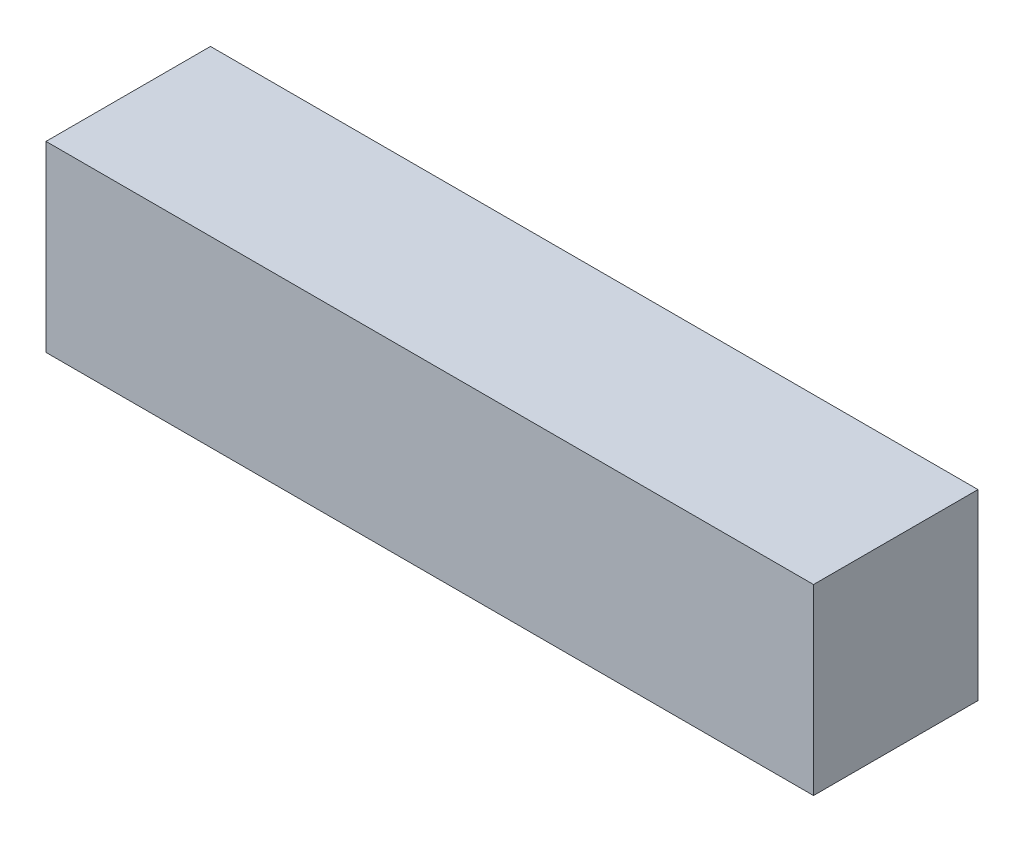
ISO-10303-21;
HEADER;
FILE_DESCRIPTION(('STEP AP214'),'2;1');
FILE_NAME('part.step','',(''),(''),'','','');
FILE_SCHEMA(('AUTOMOTIVE_DESIGN { 1 0 10303 214 1 1 1 1 }'));
ENDSEC;
DATA;
#1=APPLICATION_CONTEXT('core data for automotive mechanical design processes');
#2=APPLICATION_PROTOCOL_DEFINITION('international standard','automotive_design',2000,#1);
#3=PRODUCT_CONTEXT('',#1,'mechanical');
#4=PRODUCT('Part','Part','',(#3));
#5=PRODUCT_RELATED_PRODUCT_CATEGORY('part','',(#4));
#6=PRODUCT_DEFINITION_FORMATION('','',#4);
#7=PRODUCT_DEFINITION_CONTEXT('part definition',#1,'design');
#8=PRODUCT_DEFINITION('design','',#6,#7);
#9=PRODUCT_DEFINITION_SHAPE('','',#8);
#10=(LENGTH_UNIT() NAMED_UNIT(*) SI_UNIT(.MILLI.,.METRE.));
#11=(NAMED_UNIT(*) PLANE_ANGLE_UNIT() SI_UNIT($,.RADIAN.));
#12=(NAMED_UNIT(*) SI_UNIT($,.STERADIAN.) SOLID_ANGLE_UNIT());
#13=UNCERTAINTY_MEASURE_WITH_UNIT(LENGTH_MEASURE(1.E-05),#10,'distance_accuracy_value','');
#14=(GEOMETRIC_REPRESENTATION_CONTEXT(3) GLOBAL_UNCERTAINTY_ASSIGNED_CONTEXT((#13)) GLOBAL_UNIT_ASSIGNED_CONTEXT((#10,
#11,#12)) REPRESENTATION_CONTEXT('',''));
#15=CARTESIAN_POINT('',(0.,0.,0.));
#16=DIRECTION('',(0.,0.,1.));
#17=DIRECTION('',(1.,0.,0.));
#18=AXIS2_PLACEMENT_3D('',#15,#16,#17);
#19=CARTESIAN_POINT('',(0.,166.7,150.));
#20=DIRECTION('',(1.,0.,0.));
#21=DIRECTION('',(0.,1.,0.));
#22=AXIS2_PLACEMENT_3D('',#19,#20,#21);
#23=PLANE('',#22);
#24=DIRECTION('',(0.,-1.,0.));
#25=VECTOR('',#24,1.);
#26=CARTESIAN_POINT('',(0.,166.7,0.));
#27=LINE('',#26,#25);
#28=CARTESIAN_POINT('',(0.,166.7,0.));
#29=VERTEX_POINT('',#28);
#30=CARTESIAN_POINT('',(0.,0.,0.));
#31=VERTEX_POINT('',#30);
#32=EDGE_CURVE('E95',#29,#31,#27,.T.);
#33=ORIENTED_EDGE('',*,*,#32,.T.);
#34=DIRECTION('',(0.,0.,-1.));
#35=VECTOR('',#34,1.);
#36=CARTESIAN_POINT('',(0.,0.,150.));
#37=LINE('',#36,#35);
#38=CARTESIAN_POINT('',(0.,0.,150.));
#39=VERTEX_POINT('',#38);
#40=EDGE_CURVE('E11',#39,#31,#37,.T.);
#41=ORIENTED_EDGE('',*,*,#40,.F.);
#42=DIRECTION('',(0.,-1.,0.));
#43=VECTOR('',#42,1.);
#44=CARTESIAN_POINT('',(0.,166.7,150.));
#45=LINE('',#44,#43);
#46=CARTESIAN_POINT('',(0.,166.7,150.));
#47=VERTEX_POINT('',#46);
#48=EDGE_CURVE('E83',#47,#39,#45,.T.);
#49=ORIENTED_EDGE('',*,*,#48,.F.);
#50=DIRECTION('',(0.,0.,-1.));
#51=VECTOR('',#50,1.);
#52=CARTESIAN_POINT('',(0.,166.7,150.));
#53=LINE('',#52,#51);
#54=EDGE_CURVE('E91',#47,#29,#53,.T.);
#55=ORIENTED_EDGE('',*,*,#54,.T.);
#56=EDGE_LOOP('',(#33,#41,#49,#55));
#57=FACE_BOUND('',#56,.T.);
#58=ADVANCED_FACE('F32',(#57),#23,.F.);
#59=CARTESIAN_POINT('',(0.,0.,150.));
#60=DIRECTION('',(0.,1.,0.));
#61=DIRECTION('',(0.,0.,1.));
#62=AXIS2_PLACEMENT_3D('',#59,#60,#61);
#63=PLANE('',#62);
#64=DIRECTION('',(1.,0.,0.));
#65=VECTOR('',#64,1.);
#66=CARTESIAN_POINT('',(0.,0.,0.));
#67=LINE('',#66,#65);
#68=CARTESIAN_POINT('',(700.,0.,0.));
#69=VERTEX_POINT('',#68);
#70=EDGE_CURVE('E87',#31,#69,#67,.T.);
#71=ORIENTED_EDGE('',*,*,#70,.T.);
#72=DIRECTION('',(0.,0.,-1.));
#73=VECTOR('',#72,1.);
#74=CARTESIAN_POINT('',(700.,0.,150.));
#75=LINE('',#74,#73);
#76=CARTESIAN_POINT('',(700.,0.,150.));
#77=VERTEX_POINT('',#76);
#78=EDGE_CURVE('E40',#77,#69,#75,.T.);
#79=ORIENTED_EDGE('',*,*,#78,.F.);
#80=DIRECTION('',(1.,0.,0.));
#81=VECTOR('',#80,1.);
#82=CARTESIAN_POINT('',(0.,0.,150.));
#83=LINE('',#82,#81);
#84=EDGE_CURVE('E78',#39,#77,#83,.T.);
#85=ORIENTED_EDGE('',*,*,#84,.F.);
#86=ORIENTED_EDGE('',*,*,#40,.T.);
#87=EDGE_LOOP('',(#71,#79,#85,#86));
#88=FACE_BOUND('',#87,.T.);
#89=ADVANCED_FACE('F86',(#88),#63,.F.);
#90=CARTESIAN_POINT('',(700.,166.7,150.));
#91=DIRECTION('',(-1.,0.,0.));
#92=DIRECTION('',(0.,0.,1.));
#93=AXIS2_PLACEMENT_3D('',#90,#91,#92);
#94=PLANE('',#93);
#95=DIRECTION('',(0.,1.,0.));
#96=VECTOR('',#95,1.);
#97=CARTESIAN_POINT('',(700.,166.7,0.));
#98=LINE('',#97,#96);
#99=CARTESIAN_POINT('',(700.,166.7,0.));
#100=VERTEX_POINT('',#99);
#101=EDGE_CURVE('E65',#69,#100,#98,.T.);
#102=ORIENTED_EDGE('',*,*,#101,.T.);
#103=DIRECTION('',(0.,0.,-1.));
#104=VECTOR('',#103,1.);
#105=CARTESIAN_POINT('',(700.,166.7,150.));
#106=LINE('',#105,#104);
#107=CARTESIAN_POINT('',(700.,166.7,150.));
#108=VERTEX_POINT('',#107);
#109=EDGE_CURVE('E88',#108,#100,#106,.T.);
#110=ORIENTED_EDGE('',*,*,#109,.F.);
#111=DIRECTION('',(0.,1.,0.));
#112=VECTOR('',#111,1.);
#113=CARTESIAN_POINT('',(700.,166.7,150.));
#114=LINE('',#113,#112);
#115=EDGE_CURVE('E81',#77,#108,#114,.T.);
#116=ORIENTED_EDGE('',*,*,#115,.F.);
#117=ORIENTED_EDGE('',*,*,#78,.T.);
#118=EDGE_LOOP('',(#102,#110,#116,#117));
#119=FACE_BOUND('',#118,.T.);
#120=ADVANCED_FACE('F89',(#119),#94,.F.);
#121=CARTESIAN_POINT('',(0.,166.7,150.));
#122=DIRECTION('',(0.,-1.,0.));
#123=DIRECTION('',(0.,0.,-1.));
#124=AXIS2_PLACEMENT_3D('',#121,#122,#123);
#125=PLANE('',#124);
#126=DIRECTION('',(-1.,0.,0.));
#127=VECTOR('',#126,1.);
#128=CARTESIAN_POINT('',(0.,166.7,0.));
#129=LINE('',#128,#127);
#130=EDGE_CURVE('E71',#100,#29,#129,.T.);
#131=ORIENTED_EDGE('',*,*,#130,.T.);
#132=ORIENTED_EDGE('',*,*,#54,.F.);
#133=DIRECTION('',(-1.,0.,0.));
#134=VECTOR('',#133,1.);
#135=CARTESIAN_POINT('',(0.,166.7,150.));
#136=LINE('',#135,#134);
#137=EDGE_CURVE('E48',#108,#47,#136,.T.);
#138=ORIENTED_EDGE('',*,*,#137,.F.);
#139=ORIENTED_EDGE('',*,*,#109,.T.);
#140=EDGE_LOOP('',(#131,#132,#138,#139));
#141=FACE_BOUND('',#140,.T.);
#142=ADVANCED_FACE('F102',(#141),#125,.F.);
#143=CARTESIAN_POINT('',(0.,0.,150.));
#144=DIRECTION('',(0.,0.,1.));
#145=DIRECTION('',(1.,0.,0.));
#146=AXIS2_PLACEMENT_3D('',#143,#144,#145);
#147=PLANE('',#146);
#148=ORIENTED_EDGE('',*,*,#48,.T.);
#149=ORIENTED_EDGE('',*,*,#84,.T.);
#150=ORIENTED_EDGE('',*,*,#115,.T.);
#151=ORIENTED_EDGE('',*,*,#137,.T.);
#152=EDGE_LOOP('',(#148,#149,#150,#151));
#153=FACE_BOUND('',#152,.T.);
#154=ADVANCED_FACE('F79',(#153),#147,.T.);
#155=CARTESIAN_POINT('',(0.,0.,0.));
#156=DIRECTION('',(0.,0.,1.));
#157=DIRECTION('',(1.,0.,0.));
#158=AXIS2_PLACEMENT_3D('',#155,#156,#157);
#159=PLANE('',#158);
#160=ORIENTED_EDGE('',*,*,#32,.F.);
#161=ORIENTED_EDGE('',*,*,#130,.F.);
#162=ORIENTED_EDGE('',*,*,#101,.F.);
#163=ORIENTED_EDGE('',*,*,#70,.F.);
#164=EDGE_LOOP('',(#160,#161,#162,#163));
#165=FACE_BOUND('',#164,.T.);
#166=ADVANCED_FACE('F105',(#165),#159,.F.);
#167=CLOSED_SHELL('',(#58,#89,#120,#142,#154,#166));
#168=MANIFOLD_SOLID_BREP('B2',#167);
#169=ADVANCED_BREP_SHAPE_REPRESENTATION('',(#18,#168),#14);
#170=SHAPE_DEFINITION_REPRESENTATION(#9,#169);
ENDSEC;
END-ISO-10303-21;
